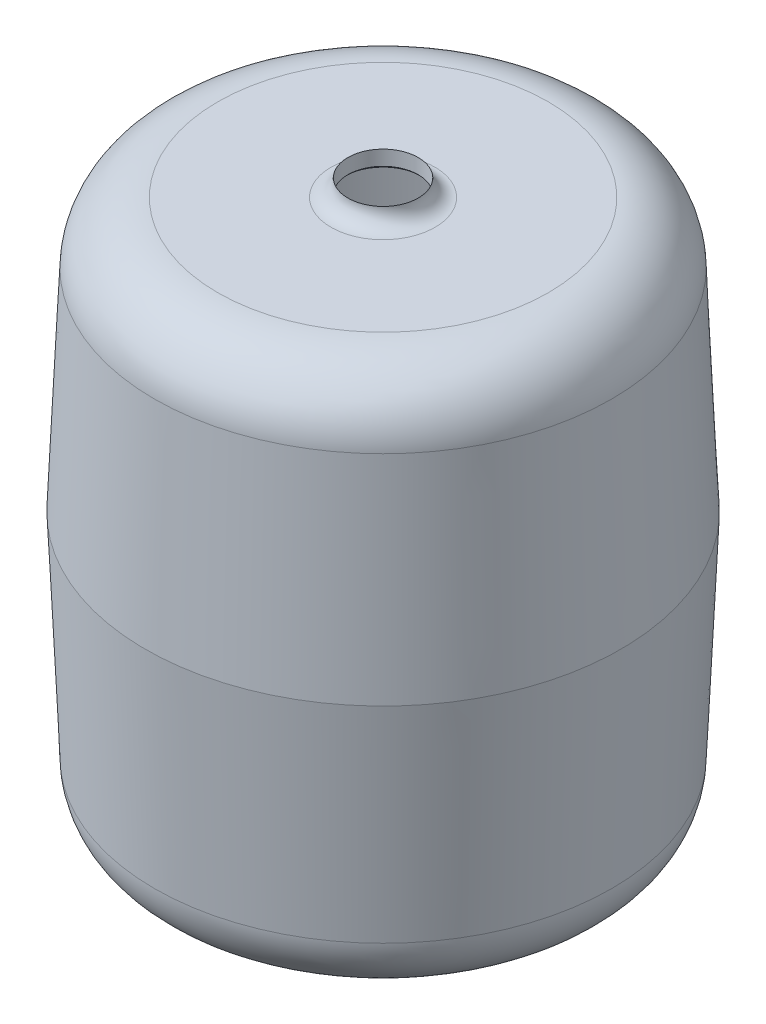
ISO-10303-21;
HEADER;
FILE_DESCRIPTION(('STEP AP214'),'2;1');
FILE_NAME('part.step','',(''),(''),'','','');
FILE_SCHEMA(('AUTOMOTIVE_DESIGN { 1 0 10303 214 1 1 1 1 }'));
ENDSEC;
DATA;
#1=APPLICATION_CONTEXT('core data for automotive mechanical design processes');
#2=APPLICATION_PROTOCOL_DEFINITION('international standard','automotive_design',2000,#1);
#3=PRODUCT_CONTEXT('',#1,'mechanical');
#4=PRODUCT('Part','Part','',(#3));
#5=PRODUCT_RELATED_PRODUCT_CATEGORY('part','',(#4));
#6=PRODUCT_DEFINITION_FORMATION('','',#4);
#7=PRODUCT_DEFINITION_CONTEXT('part definition',#1,'design');
#8=PRODUCT_DEFINITION('design','',#6,#7);
#9=PRODUCT_DEFINITION_SHAPE('','',#8);
#10=(LENGTH_UNIT() NAMED_UNIT(*) SI_UNIT(.MILLI.,.METRE.));
#11=(NAMED_UNIT(*) PLANE_ANGLE_UNIT() SI_UNIT($,.RADIAN.));
#12=(NAMED_UNIT(*) SI_UNIT($,.STERADIAN.) SOLID_ANGLE_UNIT());
#13=UNCERTAINTY_MEASURE_WITH_UNIT(LENGTH_MEASURE(1.E-05),#10,'distance_accuracy_value','');
#14=(GEOMETRIC_REPRESENTATION_CONTEXT(3) GLOBAL_UNCERTAINTY_ASSIGNED_CONTEXT((#13)) GLOBAL_UNIT_ASSIGNED_CONTEXT((#10,
#11,#12)) REPRESENTATION_CONTEXT('',''));
#15=CARTESIAN_POINT('',(0.,0.,0.));
#16=DIRECTION('',(0.,0.,1.));
#17=DIRECTION('',(1.,0.,0.));
#18=AXIS2_PLACEMENT_3D('',#15,#16,#17);
#19=CARTESIAN_POINT('',(51.53743608999,-189.75,0.));
#20=DIRECTION('',(0.,-1.,0.));
#21=DIRECTION('',(1.,0.,0.));
#22=AXIS2_PLACEMENT_3D('',#19,#20,#21);
#23=PLANE('',#22);
#24=CARTESIAN_POINT('',(169.080266118806,-189.75,0.));
#25=DIRECTION('',(0.,-1.,0.));
#26=DIRECTION('',(1.,0.,0.));
#27=AXIS2_PLACEMENT_3D('',#24,#25,#26);
#28=CIRCLE('',#27,25.);
#29=CARTESIAN_POINT('',(144.080266118806,-189.75,0.));
#30=VERTEX_POINT('',#29);
#31=EDGE_CURVE('E84',#30,#30,#28,.T.);
#32=ORIENTED_EDGE('',*,*,#31,.T.);
#33=EDGE_LOOP('',(#32));
#34=FACE_BOUND('',#33,.T.);
#35=CARTESIAN_POINT('',(169.080266118806,-189.75,0.));
#36=DIRECTION('',(0.,1.,0.));
#37=DIRECTION('',(-1.,0.,0.));
#38=AXIS2_PLACEMENT_3D('',#35,#36,#37);
#39=CIRCLE('',#38,117.542830028816);
#40=CARTESIAN_POINT('',(51.53743608999,-189.75,0.));
#41=VERTEX_POINT('',#40);
#42=EDGE_CURVE('E63',#41,#41,#39,.T.);
#43=ORIENTED_EDGE('',*,*,#42,.T.);
#44=EDGE_LOOP('',(#43));
#45=FACE_BOUND('',#44,.T.);
#46=ADVANCED_FACE('F37',(#34,#45),#23,.F.);
#47=CARTESIAN_POINT('',(169.080266118806,-148.75,0.));
#48=DIRECTION('',(0.,1.,0.));
#49=DIRECTION('',(-1.,0.,0.));
#50=AXIS2_PLACEMENT_3D('',#47,#48,#49);
#51=TOROIDAL_SURFACE('',#50,117.542830028816,41.);
#52=ORIENTED_EDGE('',*,*,#42,.F.);
#53=EDGE_LOOP('',(#52));
#54=FACE_BOUND('',#53,.T.);
#55=CARTESIAN_POINT('',(169.080266118806,-150.538394881979,0.));
#56=DIRECTION('',(0.,1.,0.));
#57=DIRECTION('',(-1.,0.,0.));
#58=AXIS2_PLACEMENT_3D('',#55,#56,#57);
#59=CIRCLE('',#58,158.503807113673);
#60=CARTESIAN_POINT('',(10.5764590051338,-150.538394881979,0.));
#61=VERTEX_POINT('',#60);
#62=EDGE_CURVE('E66',#61,#61,#59,.T.);
#63=ORIENTED_EDGE('',*,*,#62,.T.);
#64=EDGE_LOOP('',(#63));
#65=FACE_BOUND('',#64,.T.);
#66=ADVANCED_FACE('F112',(#54,#65),#51,.F.);
#67=CARTESIAN_POINT('',(169.080266118806,0.,0.));
#68=DIRECTION('',(0.,1.,0.));
#69=DIRECTION('',(-1.,0.,0.));
#70=AXIS2_PLACEMENT_3D('',#67,#68,#69);
#71=CONICAL_SURFACE('',#70,165.076455378153,0.0436332312998541);
#72=ORIENTED_EDGE('',*,*,#62,.F.);
#73=EDGE_LOOP('',(#72));
#74=FACE_BOUND('',#73,.T.);
#75=CARTESIAN_POINT('',(169.080266118806,0.,0.));
#76=DIRECTION('',(0.,1.,0.));
#77=DIRECTION('',(-1.,0.,0.));
#78=AXIS2_PLACEMENT_3D('',#75,#76,#77);
#79=CIRCLE('',#78,165.076455378153);
#80=CARTESIAN_POINT('',(4.00381074065329,0.,0.));
#81=VERTEX_POINT('',#80);
#82=EDGE_CURVE('E69',#81,#81,#79,.T.);
#83=ORIENTED_EDGE('',*,*,#82,.T.);
#84=EDGE_LOOP('',(#83));
#85=FACE_BOUND('',#84,.T.);
#86=ADVANCED_FACE('F119',(#74,#85),#71,.F.);
#87=CARTESIAN_POINT('',(169.080266118806,150.538394881978,0.));
#88=DIRECTION('',(0.,-1.,0.));
#89=DIRECTION('',(1.,0.,0.));
#90=AXIS2_PLACEMENT_3D('',#87,#88,#89);
#91=CONICAL_SURFACE('',#90,158.503807113673,0.0436332312998545);
#92=ORIENTED_EDGE('',*,*,#82,.F.);
#93=EDGE_LOOP('',(#92));
#94=FACE_BOUND('',#93,.T.);
#95=CARTESIAN_POINT('',(169.080266118806,150.538394881978,0.));
#96=DIRECTION('',(0.,1.,0.));
#97=DIRECTION('',(-1.,0.,0.));
#98=AXIS2_PLACEMENT_3D('',#95,#96,#97);
#99=CIRCLE('',#98,158.503807113673);
#100=CARTESIAN_POINT('',(10.5764590051338,150.538394881978,0.));
#101=VERTEX_POINT('',#100);
#102=EDGE_CURVE('E72',#101,#101,#99,.T.);
#103=ORIENTED_EDGE('',*,*,#102,.T.);
#104=EDGE_LOOP('',(#103));
#105=FACE_BOUND('',#104,.T.);
#106=ADVANCED_FACE('F201',(#94,#105),#91,.F.);
#107=CARTESIAN_POINT('',(169.080266118806,148.75,0.));
#108=DIRECTION('',(0.,1.,0.));
#109=DIRECTION('',(-1.,0.,0.));
#110=AXIS2_PLACEMENT_3D('',#107,#108,#109);
#111=TOROIDAL_SURFACE('',#110,117.542830028816,41.);
#112=ORIENTED_EDGE('',*,*,#102,.F.);
#113=EDGE_LOOP('',(#112));
#114=FACE_BOUND('',#113,.T.);
#115=CARTESIAN_POINT('',(169.080266118806,189.75,0.));
#116=DIRECTION('',(0.,1.,0.));
#117=DIRECTION('',(-1.,0.,0.));
#118=AXIS2_PLACEMENT_3D('',#115,#116,#117);
#119=CIRCLE('',#118,117.542830028816);
#120=CARTESIAN_POINT('',(51.53743608999,189.75,0.));
#121=VERTEX_POINT('',#120);
#122=EDGE_CURVE('E75',#121,#121,#119,.T.);
#123=ORIENTED_EDGE('',*,*,#122,.T.);
#124=EDGE_LOOP('',(#123));
#125=FACE_BOUND('',#124,.T.);
#126=ADVANCED_FACE('F191',(#114,#125),#111,.F.);
#127=CARTESIAN_POINT('',(51.53743608999,189.75,0.));
#128=DIRECTION('',(0.,1.,0.));
#129=DIRECTION('',(-1.,0.,0.));
#130=AXIS2_PLACEMENT_3D('',#127,#128,#129);
#131=PLANE('',#130);
#132=ORIENTED_EDGE('',*,*,#122,.F.);
#133=EDGE_LOOP('',(#132));
#134=FACE_BOUND('',#133,.T.);
#135=CARTESIAN_POINT('',(169.080266118806,189.75,0.));
#136=DIRECTION('',(0.,1.,0.));
#137=DIRECTION('',(-1.,0.,0.));
#138=AXIS2_PLACEMENT_3D('',#135,#136,#137);
#139=CIRCLE('',#138,37.);
#140=CARTESIAN_POINT('',(132.080266118806,189.75,0.));
#141=VERTEX_POINT('',#140);
#142=EDGE_CURVE('E78',#141,#141,#139,.T.);
#143=ORIENTED_EDGE('',*,*,#142,.T.);
#144=EDGE_LOOP('',(#143));
#145=FACE_BOUND('',#144,.T.);
#146=ADVANCED_FACE('F108',(#134,#145),#131,.F.);
#147=CARTESIAN_POINT('',(169.080266118806,205.75,0.));
#148=DIRECTION('',(0.,1.,0.));
#149=DIRECTION('',(-1.,0.,0.));
#150=AXIS2_PLACEMENT_3D('',#147,#148,#149);
#151=TOROIDAL_SURFACE('',#150,37.,16.);
#152=CARTESIAN_POINT('',(169.080266118806,195.166994755741,0.));
#153=DIRECTION('',(0.,1.,0.));
#154=DIRECTION('',(-1.,0.,0.));
#155=AXIS2_PLACEMENT_3D('',#152,#153,#154);
#156=CIRCLE('',#155,25.);
#157=CARTESIAN_POINT('',(144.080266118806,195.166994755741,0.));
#158=VERTEX_POINT('',#157);
#159=EDGE_CURVE('E41',#158,#158,#156,.T.);
#160=ORIENTED_EDGE('',*,*,#159,.T.);
#161=EDGE_LOOP('',(#160));
#162=FACE_BOUND('',#161,.T.);
#163=ORIENTED_EDGE('',*,*,#142,.F.);
#164=EDGE_LOOP('',(#163));
#165=FACE_BOUND('',#164,.T.);
#166=ADVANCED_FACE('F94',(#162,#165),#151,.T.);
#167=CARTESIAN_POINT('',(169.080266118806,-191.75,0.));
#168=DIRECTION('',(0.,1.,0.));
#169=DIRECTION('',(-1.,0.,0.));
#170=AXIS2_PLACEMENT_3D('',#167,#168,#169);
#171=CYLINDRICAL_SURFACE('',#170,25.);
#172=CARTESIAN_POINT('',(169.080266118806,205.75,0.));
#173=DIRECTION('',(0.,1.,0.));
#174=DIRECTION('',(-1.,0.,0.));
#175=AXIS2_PLACEMENT_3D('',#172,#173,#174);
#176=CIRCLE('',#175,25.);
#177=CARTESIAN_POINT('',(144.080266118806,205.75,0.));
#178=VERTEX_POINT('',#177);
#179=EDGE_CURVE('E81',#178,#178,#176,.T.);
#180=CARTESIAN_POINT('',(144.080266118806,205.75,0.));
#181=CARTESIAN_POINT('',(144.080266118806,205.639760362039,0.));
#182=CARTESIAN_POINT('',(144.080266118806,205.529520724078,0.));
#183=CARTESIAN_POINT('',(144.080266118806,205.309041448155,0.));
#184=CARTESIAN_POINT('',(144.080266118806,205.198801810194,0.));
#185=CARTESIAN_POINT('',(144.080266118806,204.978322534272,0.));
#186=CARTESIAN_POINT('',(144.080266118806,204.868082896311,0.));
#187=CARTESIAN_POINT('',(144.080266118806,204.647603620389,0.));
#188=CARTESIAN_POINT('',(144.080266118806,204.537363982428,0.));
#189=CARTESIAN_POINT('',(144.080266118806,204.316884706506,0.));
#190=CARTESIAN_POINT('',(144.080266118806,204.206645068545,0.));
#191=CARTESIAN_POINT('',(144.080266118806,203.986165792623,0.));
#192=CARTESIAN_POINT('',(144.080266118806,203.875926154662,0.));
#193=CARTESIAN_POINT('',(144.080266118806,203.65544687874,0.));
#194=CARTESIAN_POINT('',(144.080266118806,203.545207240779,0.));
#195=CARTESIAN_POINT('',(144.080266118806,203.324727964857,0.));
#196=CARTESIAN_POINT('',(144.080266118806,203.214488326896,0.));
#197=CARTESIAN_POINT('',(144.080266118806,202.994009050974,0.));
#198=CARTESIAN_POINT('',(144.080266118806,202.883769413013,0.));
#199=CARTESIAN_POINT('',(144.080266118806,202.663290137091,0.));
#200=CARTESIAN_POINT('',(144.080266118806,202.55305049913,0.));
#201=CARTESIAN_POINT('',(144.080266118806,202.332571223208,0.));
#202=CARTESIAN_POINT('',(144.080266118806,202.222331585247,0.));
#203=CARTESIAN_POINT('',(144.080266118806,202.001852309325,0.));
#204=CARTESIAN_POINT('',(144.080266118806,201.891612671364,0.));
#205=CARTESIAN_POINT('',(144.080266118806,201.671133395442,0.));
#206=CARTESIAN_POINT('',(144.080266118806,201.560893757481,0.));
#207=CARTESIAN_POINT('',(144.080266118806,201.340414481559,0.));
#208=CARTESIAN_POINT('',(144.080266118806,201.230174843598,0.));
#209=CARTESIAN_POINT('',(144.080266118806,201.009695567676,0.));
#210=CARTESIAN_POINT('',(144.080266118806,200.899455929715,0.));
#211=CARTESIAN_POINT('',(144.080266118806,200.678976653792,0.));
#212=CARTESIAN_POINT('',(144.080266118806,200.568737015831,0.));
#213=CARTESIAN_POINT('',(144.080266118806,200.348257739909,0.));
#214=CARTESIAN_POINT('',(144.080266118806,200.238018101948,0.));
#215=CARTESIAN_POINT('',(144.080266118806,200.017538826026,0.));
#216=CARTESIAN_POINT('',(144.080266118806,199.907299188065,0.));
#217=CARTESIAN_POINT('',(144.080266118806,199.686819912143,0.));
#218=CARTESIAN_POINT('',(144.080266118806,199.576580274182,0.));
#219=CARTESIAN_POINT('',(144.080266118806,199.35610099826,0.));
#220=CARTESIAN_POINT('',(144.080266118806,199.245861360299,0.));
#221=CARTESIAN_POINT('',(144.080266118806,199.025382084377,0.));
#222=CARTESIAN_POINT('',(144.080266118806,198.915142446416,0.));
#223=CARTESIAN_POINT('',(144.080266118806,198.694663170494,0.));
#224=CARTESIAN_POINT('',(144.080266118806,198.584423532533,0.));
#225=CARTESIAN_POINT('',(144.080266118806,198.363944256611,0.));
#226=CARTESIAN_POINT('',(144.080266118806,198.25370461865,0.));
#227=CARTESIAN_POINT('',(144.080266118806,198.033225342728,0.));
#228=CARTESIAN_POINT('',(144.080266118806,197.922985704767,0.));
#229=CARTESIAN_POINT('',(144.080266118806,197.702506428845,0.));
#230=CARTESIAN_POINT('',(144.080266118806,197.592266790884,0.));
#231=CARTESIAN_POINT('',(144.080266118806,197.371787514962,0.));
#232=CARTESIAN_POINT('',(144.080266118806,197.261547877001,0.));
#233=CARTESIAN_POINT('',(144.080266118806,197.041068601079,0.));
#234=CARTESIAN_POINT('',(144.080266118806,196.930828963118,0.));
#235=CARTESIAN_POINT('',(144.080266118806,196.710349687196,0.));
#236=CARTESIAN_POINT('',(144.080266118806,196.600110049235,0.));
#237=CARTESIAN_POINT('',(144.080266118806,196.379630773312,0.));
#238=CARTESIAN_POINT('',(144.080266118806,196.269391135351,0.));
#239=CARTESIAN_POINT('',(144.080266118806,196.048911859429,0.));
#240=CARTESIAN_POINT('',(144.080266118806,195.938672221468,0.));
#241=CARTESIAN_POINT('',(144.080266118806,195.718192945546,0.));
#242=CARTESIAN_POINT('',(144.080266118806,195.607953307585,0.));
#243=CARTESIAN_POINT('',(144.080266118806,195.387474031663,0.));
#244=CARTESIAN_POINT('',(144.080266118806,195.277234393702,0.));
#245=CARTESIAN_POINT('',(144.080266118806,195.166994755741,0.));
#246=B_SPLINE_CURVE_WITH_KNOTS('',3,(#180,#181,#182,#183,#184,#185,#186,#187,#188,#189,#190,
#191,#192,#193,#194,#195,#196,#197,#198,#199,#200,#201,#202,#203,#204,#205,#206,#207,#208,#209,
#210,#211,#212,#213,#214,#215,#216,#217,#218,#219,#220,#221,#222,#223,#224,#225,#226,#227,#228,
#229,#230,#231,#232,#233,#234,#235,#236,#237,#238,#239,#240,#241,#242,#243,#244,#245),
.UNSPECIFIED.,.F.,.F.,(4,2,2,2,2,2,2,2,2,2,2,2,2,2,2,2,2,2,2,2,2,2,2,2,2,2,2,2,2,2,2,2,4),(0.,
0.330718913883088,0.661437827766176,0.992156741649208,1.3228756555323,1.65359456941538,
1.98431348329842,2.3150323971815,2.64575131106459,2.97647022494768,3.30718913883077,
3.6379080527138,3.96862696659689,4.29934588047998,4.63006479436301,4.9607837082461,
5.29150262212918,5.62222153601227,5.95294044989536,6.28365936377839,6.61437827766148,
6.94509719154457,7.2758161054276,7.60653501931069,7.93725393319378,8.26797284707687,
8.59869176095995,8.92941067484299,9.26012958872607,9.59084850260916,9.92156741649219,
10.2522863303753,10.5830052442584),.UNSPECIFIED.);
#247=EDGE_CURVE('BSEAM97',#178,#158,#246,.T.);
#248=ORIENTED_EDGE('',*,*,#179,.T.);
#249=ORIENTED_EDGE('',*,*,#159,.F.);
#250=ORIENTED_EDGE('',*,*,#247,.T.);
#251=ORIENTED_EDGE('',*,*,#247,.F.);
#252=EDGE_LOOP('',(#248,#250,#249,#251));
#253=FACE_BOUND('',#252,.T.);
#254=ADVANCED_FACE('F97',(#253),#171,.F.);
#255=CARTESIAN_POINT('',(169.080266118806,-191.75,0.));
#256=DIRECTION('',(0.,1.,0.));
#257=DIRECTION('',(-1.,0.,0.));
#258=AXIS2_PLACEMENT_3D('',#255,#256,#257);
#259=CIRCLE('',#258,25.);
#260=CARTESIAN_POINT('',(144.080266118806,-191.75,0.));
#261=VERTEX_POINT('',#260);
#262=EDGE_CURVE('E87',#261,#261,#259,.T.);
#263=CARTESIAN_POINT('',(144.080266118806,-191.75,0.));
#264=CARTESIAN_POINT('',(144.080266118806,-191.729166666667,0.));
#265=CARTESIAN_POINT('',(144.080266118806,-191.708333333334,0.));
#266=CARTESIAN_POINT('',(144.080266118806,-191.666666666667,0.));
#267=CARTESIAN_POINT('',(144.080266118806,-191.645833333334,0.));
#268=CARTESIAN_POINT('',(144.080266118806,-191.604166666667,0.));
#269=CARTESIAN_POINT('',(144.080266118806,-191.583333333334,0.));
#270=CARTESIAN_POINT('',(144.080266118806,-191.541666666667,0.));
#271=CARTESIAN_POINT('',(144.080266118806,-191.520833333334,0.));
#272=CARTESIAN_POINT('',(144.080266118806,-191.479166666667,0.));
#273=CARTESIAN_POINT('',(144.080266118806,-191.458333333334,0.));
#274=CARTESIAN_POINT('',(144.080266118806,-191.416666666667,0.));
#275=CARTESIAN_POINT('',(144.080266118806,-191.395833333334,0.));
#276=CARTESIAN_POINT('',(144.080266118806,-191.354166666667,0.));
#277=CARTESIAN_POINT('',(144.080266118806,-191.333333333334,0.));
#278=CARTESIAN_POINT('',(144.080266118806,-191.291666666667,0.));
#279=CARTESIAN_POINT('',(144.080266118806,-191.270833333334,0.));
#280=CARTESIAN_POINT('',(144.080266118806,-191.229166666667,0.));
#281=CARTESIAN_POINT('',(144.080266118806,-191.208333333334,0.));
#282=CARTESIAN_POINT('',(144.080266118806,-191.166666666667,0.));
#283=CARTESIAN_POINT('',(144.080266118806,-191.145833333334,0.));
#284=CARTESIAN_POINT('',(144.080266118806,-191.104166666667,0.));
#285=CARTESIAN_POINT('',(144.080266118806,-191.083333333334,0.));
#286=CARTESIAN_POINT('',(144.080266118806,-191.041666666667,0.));
#287=CARTESIAN_POINT('',(144.080266118806,-191.020833333334,0.));
#288=CARTESIAN_POINT('',(144.080266118806,-190.979166666667,0.));
#289=CARTESIAN_POINT('',(144.080266118806,-190.958333333334,0.));
#290=CARTESIAN_POINT('',(144.080266118806,-190.916666666667,0.));
#291=CARTESIAN_POINT('',(144.080266118806,-190.895833333334,0.));
#292=CARTESIAN_POINT('',(144.080266118806,-190.854166666667,0.));
#293=CARTESIAN_POINT('',(144.080266118806,-190.833333333334,0.));
#294=CARTESIAN_POINT('',(144.080266118806,-190.791666666667,0.));
#295=CARTESIAN_POINT('',(144.080266118806,-190.770833333334,0.));
#296=CARTESIAN_POINT('',(144.080266118806,-190.729166666667,0.));
#297=CARTESIAN_POINT('',(144.080266118806,-190.708333333334,0.));
#298=CARTESIAN_POINT('',(144.080266118806,-190.666666666667,0.));
#299=CARTESIAN_POINT('',(144.080266118806,-190.645833333334,0.));
#300=CARTESIAN_POINT('',(144.080266118806,-190.604166666667,0.));
#301=CARTESIAN_POINT('',(144.080266118806,-190.583333333334,0.));
#302=CARTESIAN_POINT('',(144.080266118806,-190.541666666667,0.));
#303=CARTESIAN_POINT('',(144.080266118806,-190.520833333334,0.));
#304=CARTESIAN_POINT('',(144.080266118806,-190.479166666667,0.));
#305=CARTESIAN_POINT('',(144.080266118806,-190.458333333334,0.));
#306=CARTESIAN_POINT('',(144.080266118806,-190.416666666667,0.));
#307=CARTESIAN_POINT('',(144.080266118806,-190.395833333334,0.));
#308=CARTESIAN_POINT('',(144.080266118806,-190.354166666667,0.));
#309=CARTESIAN_POINT('',(144.080266118806,-190.333333333334,0.));
#310=CARTESIAN_POINT('',(144.080266118806,-190.291666666667,0.));
#311=CARTESIAN_POINT('',(144.080266118806,-190.270833333334,0.));
#312=CARTESIAN_POINT('',(144.080266118806,-190.229166666667,0.));
#313=CARTESIAN_POINT('',(144.080266118806,-190.208333333334,0.));
#314=CARTESIAN_POINT('',(144.080266118806,-190.166666666667,0.));
#315=CARTESIAN_POINT('',(144.080266118806,-190.145833333334,0.));
#316=CARTESIAN_POINT('',(144.080266118806,-190.104166666667,0.));
#317=CARTESIAN_POINT('',(144.080266118806,-190.083333333334,0.));
#318=CARTESIAN_POINT('',(144.080266118806,-190.041666666667,0.));
#319=CARTESIAN_POINT('',(144.080266118806,-190.020833333334,0.));
#320=CARTESIAN_POINT('',(144.080266118806,-189.979166666667,0.));
#321=CARTESIAN_POINT('',(144.080266118806,-189.958333333334,0.));
#322=CARTESIAN_POINT('',(144.080266118806,-189.916666666667,0.));
#323=CARTESIAN_POINT('',(144.080266118806,-189.895833333334,0.));
#324=CARTESIAN_POINT('',(144.080266118806,-189.854166666667,0.));
#325=CARTESIAN_POINT('',(144.080266118806,-189.833333333334,0.));
#326=CARTESIAN_POINT('',(144.080266118806,-189.791666666667,0.));
#327=CARTESIAN_POINT('',(144.080266118806,-189.770833333334,0.));
#328=CARTESIAN_POINT('',(144.080266118806,-189.75,0.));
#329=B_SPLINE_CURVE_WITH_KNOTS('',3,(#263,#264,#265,#266,#267,#268,#269,#270,#271,#272,#273,
#274,#275,#276,#277,#278,#279,#280,#281,#282,#283,#284,#285,#286,#287,#288,#289,#290,#291,#292,
#293,#294,#295,#296,#297,#298,#299,#300,#301,#302,#303,#304,#305,#306,#307,#308,#309,#310,#311,
#312,#313,#314,#315,#316,#317,#318,#319,#320,#321,#322,#323,#324,#325,#326,#327,#328),
.UNSPECIFIED.,.F.,.F.,(4,2,2,2,2,2,2,2,2,2,2,2,2,2,2,2,2,2,2,2,2,2,2,2,2,2,2,2,2,2,2,2,4),(0.,
0.0625000000000209,0.125000000000014,0.187500000000007,0.250000000000028,0.312500000000021,
0.375000000000014,0.437500000000035,0.500000000000028,0.562500000000021,0.625000000000042,
0.687500000000035,0.750000000000028,0.812500000000049,0.875000000000042,0.937500000000036,
1.00000000000003,1.06250000000005,1.12500000000004,1.18750000000004,1.25000000000006,
1.31250000000005,1.37500000000004,1.43750000000006,1.50000000000006,1.56250000000005,
1.62500000000007,1.68750000000006,1.75000000000006,1.81250000000008,1.87500000000007,
1.93750000000006,2.00000000000006),.UNSPECIFIED.);
#330=EDGE_CURVE('BSEAM99',#261,#30,#329,.T.);
#331=ORIENTED_EDGE('',*,*,#262,.F.);
#332=ORIENTED_EDGE('',*,*,#31,.F.);
#333=ORIENTED_EDGE('',*,*,#330,.T.);
#334=ORIENTED_EDGE('',*,*,#330,.F.);
#335=EDGE_LOOP('',(#331,#333,#332,#334));
#336=FACE_BOUND('',#335,.T.);
#337=ADVANCED_FACE('F99',(#336),#171,.F.);
#338=CARTESIAN_POINT('',(169.080266118806,-191.75,0.));
#339=DIRECTION('',(0.,1.,0.));
#340=DIRECTION('',(-1.,0.,0.));
#341=AXIS2_PLACEMENT_3D('',#338,#339,#340);
#342=PLANE('',#341);
#343=ORIENTED_EDGE('',*,*,#262,.T.);
#344=EDGE_LOOP('',(#343));
#345=FACE_BOUND('',#344,.T.);
#346=ADVANCED_FACE('F106',(#345),#342,.T.);
#347=CARTESIAN_POINT('',(169.080266118806,0.,0.));
#348=DIRECTION('',(0.,1.,0.));
#349=DIRECTION('',(-1.,0.,0.));
#350=AXIS2_PLACEMENT_3D('',#347,#348,#349);
#351=CONICAL_SURFACE('',#350,169.080266118806,0.0436332312998541);
#352=CARTESIAN_POINT('',(169.080266118806,-150.71287243144,0.));
#353=DIRECTION('',(0.,1.,0.));
#354=DIRECTION('',(-1.,0.,0.));
#355=AXIS2_PLACEMENT_3D('',#352,#353,#354);
#356=CIRCLE('',#355,162.5);
#357=CARTESIAN_POINT('',(6.58026611880641,-150.71287243144,0.));
#358=VERTEX_POINT('',#357);
#359=EDGE_CURVE('E10',#358,#358,#356,.T.);
#360=ORIENTED_EDGE('',*,*,#359,.T.);
#361=EDGE_LOOP('',(#360));
#362=FACE_BOUND('',#361,.T.);
#363=CARTESIAN_POINT('',(169.080266118806,0.,0.));
#364=DIRECTION('',(0.,1.,0.));
#365=DIRECTION('',(-1.,0.,0.));
#366=AXIS2_PLACEMENT_3D('',#363,#364,#365);
#367=CIRCLE('',#366,169.080266118806);
#368=CARTESIAN_POINT('',(0.,0.,0.));
#369=VERTEX_POINT('',#368);
#370=EDGE_CURVE('E60',#369,#369,#367,.T.);
#371=ORIENTED_EDGE('',*,*,#370,.F.);
#372=EDGE_LOOP('',(#371));
#373=FACE_BOUND('',#372,.T.);
#374=ADVANCED_FACE('F39',(#362,#373),#351,.T.);
#375=CARTESIAN_POINT('',(169.080266118806,-148.75,0.));
#376=DIRECTION('',(0.,1.,0.));
#377=DIRECTION('',(-1.,0.,0.));
#378=AXIS2_PLACEMENT_3D('',#375,#376,#377);
#379=TOROIDAL_SURFACE('',#378,117.542830028816,45.);
#380=CARTESIAN_POINT('',(169.080266118806,-193.75,0.));
#381=DIRECTION('',(0.,1.,0.));
#382=DIRECTION('',(-1.,0.,0.));
#383=AXIS2_PLACEMENT_3D('',#380,#381,#382);
#384=CIRCLE('',#383,117.542830028816);
#385=CARTESIAN_POINT('',(51.53743608999,-193.75,0.));
#386=VERTEX_POINT('',#385);
#387=EDGE_CURVE('E45',#386,#386,#384,.T.);
#388=ORIENTED_EDGE('',*,*,#387,.T.);
#389=EDGE_LOOP('',(#388));
#390=FACE_BOUND('',#389,.T.);
#391=ORIENTED_EDGE('',*,*,#359,.F.);
#392=EDGE_LOOP('',(#391));
#393=FACE_BOUND('',#392,.T.);
#394=ADVANCED_FACE('F143',(#390,#393),#379,.T.);
#395=CARTESIAN_POINT('',(51.53743608999,-193.75,0.));
#396=DIRECTION('',(0.,-1.,0.));
#397=DIRECTION('',(1.,0.,0.));
#398=AXIS2_PLACEMENT_3D('',#395,#396,#397);
#399=PLANE('',#398);
#400=ORIENTED_EDGE('',*,*,#387,.F.);
#401=EDGE_LOOP('',(#400));
#402=FACE_BOUND('',#401,.T.);
#403=ADVANCED_FACE('F140',(#402),#399,.T.);
#404=CARTESIAN_POINT('',(169.080266118806,205.75,0.));
#405=DIRECTION('',(0.,1.,0.));
#406=DIRECTION('',(-1.,0.,0.));
#407=AXIS2_PLACEMENT_3D('',#404,#405,#406);
#408=TOROIDAL_SURFACE('',#407,37.,12.);
#409=CARTESIAN_POINT('',(169.080266118806,193.75,0.));
#410=DIRECTION('',(0.,1.,0.));
#411=DIRECTION('',(-1.,0.,0.));
#412=AXIS2_PLACEMENT_3D('',#409,#410,#411);
#413=CIRCLE('',#412,37.);
#414=CARTESIAN_POINT('',(132.080266118806,193.75,0.));
#415=VERTEX_POINT('',#414);
#416=EDGE_CURVE('E49',#415,#415,#413,.T.);
#417=ORIENTED_EDGE('',*,*,#416,.T.);
#418=EDGE_LOOP('',(#417));
#419=FACE_BOUND('',#418,.T.);
#420=ORIENTED_EDGE('',*,*,#179,.F.);
#421=EDGE_LOOP('',(#420));
#422=FACE_BOUND('',#421,.T.);
#423=ADVANCED_FACE('F136',(#419,#422),#408,.F.);
#424=CARTESIAN_POINT('',(51.53743608999,193.75,0.));
#425=DIRECTION('',(0.,1.,0.));
#426=DIRECTION('',(-1.,0.,0.));
#427=AXIS2_PLACEMENT_3D('',#424,#425,#426);
#428=PLANE('',#427);
#429=CARTESIAN_POINT('',(169.080266118806,193.75,0.));
#430=DIRECTION('',(0.,1.,0.));
#431=DIRECTION('',(-1.,0.,0.));
#432=AXIS2_PLACEMENT_3D('',#429,#430,#431);
#433=CIRCLE('',#432,117.542830028816);
#434=CARTESIAN_POINT('',(51.53743608999,193.75,0.));
#435=VERTEX_POINT('',#434);
#436=EDGE_CURVE('E54',#435,#435,#433,.T.);
#437=ORIENTED_EDGE('',*,*,#436,.T.);
#438=EDGE_LOOP('',(#437));
#439=FACE_BOUND('',#438,.T.);
#440=ORIENTED_EDGE('',*,*,#416,.F.);
#441=EDGE_LOOP('',(#440));
#442=FACE_BOUND('',#441,.T.);
#443=ADVANCED_FACE('F132',(#439,#442),#428,.T.);
#444=CARTESIAN_POINT('',(169.080266118806,148.75,0.));
#445=DIRECTION('',(0.,1.,0.));
#446=DIRECTION('',(-1.,0.,0.));
#447=AXIS2_PLACEMENT_3D('',#444,#445,#446);
#448=TOROIDAL_SURFACE('',#447,117.542830028816,45.);
#449=CARTESIAN_POINT('',(169.080266118806,150.71287243144,0.));
#450=DIRECTION('',(0.,1.,0.));
#451=DIRECTION('',(-1.,0.,0.));
#452=AXIS2_PLACEMENT_3D('',#449,#450,#451);
#453=CIRCLE('',#452,162.5);
#454=CARTESIAN_POINT('',(6.58026611880635,150.71287243144,0.));
#455=VERTEX_POINT('',#454);
#456=EDGE_CURVE('E57',#455,#455,#453,.T.);
#457=ORIENTED_EDGE('',*,*,#456,.T.);
#458=EDGE_LOOP('',(#457));
#459=FACE_BOUND('',#458,.T.);
#460=ORIENTED_EDGE('',*,*,#436,.F.);
#461=EDGE_LOOP('',(#460));
#462=FACE_BOUND('',#461,.T.);
#463=ADVANCED_FACE('F128',(#459,#462),#448,.T.);
#464=CARTESIAN_POINT('',(169.080266118806,150.71287243144,0.));
#465=DIRECTION('',(0.,-1.,0.));
#466=DIRECTION('',(1.,0.,0.));
#467=AXIS2_PLACEMENT_3D('',#464,#465,#466);
#468=CONICAL_SURFACE('',#467,162.5,0.0436332312998545);
#469=ORIENTED_EDGE('',*,*,#370,.T.);
#470=EDGE_LOOP('',(#469));
#471=FACE_BOUND('',#470,.T.);
#472=ORIENTED_EDGE('',*,*,#456,.F.);
#473=EDGE_LOOP('',(#472));
#474=FACE_BOUND('',#473,.T.);
#475=ADVANCED_FACE('F125',(#471,#474),#468,.T.);
#476=CLOSED_SHELL('',(#46,#66,#86,#106,#126,#146,#166,#254,#337,#346,#374,#394,#403,#423,#443,
#463,#475));
#477=MANIFOLD_SOLID_BREP('B2',#476);
#478=ADVANCED_BREP_SHAPE_REPRESENTATION('',(#18,#477),#14);
#479=SHAPE_DEFINITION_REPRESENTATION(#9,#478);
ENDSEC;
END-ISO-10303-21;
